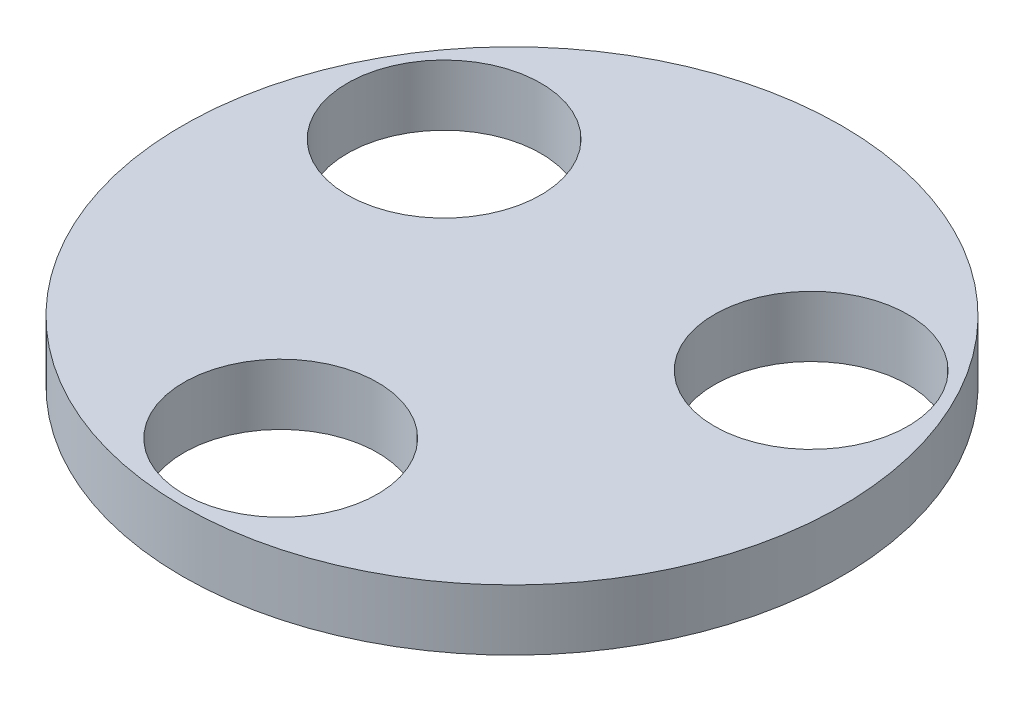
ISO-10303-21;
HEADER;
FILE_DESCRIPTION(('STEP AP214'),'2;1');
FILE_NAME('part.step','',(''),(''),'','','');
FILE_SCHEMA(('AUTOMOTIVE_DESIGN { 1 0 10303 214 1 1 1 1 }'));
ENDSEC;
DATA;
#1=APPLICATION_CONTEXT('core data for automotive mechanical design processes');
#2=APPLICATION_PROTOCOL_DEFINITION('international standard','automotive_design',2000,#1);
#3=PRODUCT_CONTEXT('',#1,'mechanical');
#4=PRODUCT('Part','Part','',(#3));
#5=PRODUCT_RELATED_PRODUCT_CATEGORY('part','',(#4));
#6=PRODUCT_DEFINITION_FORMATION('','',#4);
#7=PRODUCT_DEFINITION_CONTEXT('part definition',#1,'design');
#8=PRODUCT_DEFINITION('design','',#6,#7);
#9=PRODUCT_DEFINITION_SHAPE('','',#8);
#10=(LENGTH_UNIT() NAMED_UNIT(*) SI_UNIT(.MILLI.,.METRE.));
#11=(NAMED_UNIT(*) PLANE_ANGLE_UNIT() SI_UNIT($,.RADIAN.));
#12=(NAMED_UNIT(*) SI_UNIT($,.STERADIAN.) SOLID_ANGLE_UNIT());
#13=UNCERTAINTY_MEASURE_WITH_UNIT(LENGTH_MEASURE(1.E-05),#10,'distance_accuracy_value','');
#14=(GEOMETRIC_REPRESENTATION_CONTEXT(3) GLOBAL_UNCERTAINTY_ASSIGNED_CONTEXT((#13)) GLOBAL_UNIT_ASSIGNED_CONTEXT((#10,
#11,#12)) REPRESENTATION_CONTEXT('',''));
#15=CARTESIAN_POINT('',(0.,0.,0.));
#16=DIRECTION('',(0.,0.,1.));
#17=DIRECTION('',(1.,0.,0.));
#18=AXIS2_PLACEMENT_3D('',#15,#16,#17);
#19=CARTESIAN_POINT('',(0.,6.,0.));
#20=DIRECTION('',(0.,-1.,0.));
#21=DIRECTION('',(0.,0.,-1.));
#22=AXIS2_PLACEMENT_3D('',#19,#20,#21);
#23=CYLINDRICAL_SURFACE('',#22,32.5);
#24=CARTESIAN_POINT('',(0.,6.,0.));
#25=DIRECTION('',(0.,1.,0.));
#26=DIRECTION('',(0.,0.,1.));
#27=AXIS2_PLACEMENT_3D('',#24,#25,#26);
#28=CIRCLE('',#27,32.5);
#29=CARTESIAN_POINT('',(0.,6.,32.5));
#30=VERTEX_POINT('',#29);
#31=EDGE_CURVE('E10',#30,#30,#28,.T.);
#32=ORIENTED_EDGE('',*,*,#31,.F.);
#33=EDGE_LOOP('',(#32));
#34=FACE_BOUND('',#33,.T.);
#35=CARTESIAN_POINT('',(0.,0.,0.));
#36=DIRECTION('',(0.,1.,0.));
#37=DIRECTION('',(0.,0.,1.));
#38=AXIS2_PLACEMENT_3D('',#35,#36,#37);
#39=CIRCLE('',#38,32.5);
#40=CARTESIAN_POINT('',(0.,0.,32.5));
#41=VERTEX_POINT('',#40);
#42=EDGE_CURVE('E38',#41,#41,#39,.T.);
#43=ORIENTED_EDGE('',*,*,#42,.T.);
#44=EDGE_LOOP('',(#43));
#45=FACE_BOUND('',#44,.T.);
#46=ADVANCED_FACE('F31',(#34,#45),#23,.T.);
#47=CARTESIAN_POINT('',(0.,6.,0.));
#48=DIRECTION('',(0.,1.,0.));
#49=DIRECTION('',(0.,0.,1.));
#50=AXIS2_PLACEMENT_3D('',#47,#48,#49);
#51=PLANE('',#50);
#52=CARTESIAN_POINT('',(19.4033619757735,6.,-10.1007509145166));
#53=DIRECTION('',(0.,1.,0.));
#54=DIRECTION('',(0.,0.,1.));
#55=AXIS2_PLACEMENT_3D('',#52,#53,#54);
#56=CIRCLE('',#55,9.55);
#57=CARTESIAN_POINT('',(19.4033619757735,6.,-0.550750914516594));
#58=VERTEX_POINT('',#57);
#59=EDGE_CURVE('E98',#58,#58,#56,.T.);
#60=ORIENTED_EDGE('',*,*,#59,.F.);
#61=EDGE_LOOP('',(#60));
#62=FACE_BOUND('',#61,.T.);
#63=CARTESIAN_POINT('',(-0.954174098616478,6.,21.8541798471032));
#64=DIRECTION('',(0.,1.,0.));
#65=DIRECTION('',(0.,0.,1.));
#66=AXIS2_PLACEMENT_3D('',#63,#64,#65);
#67=CIRCLE('',#66,9.55);
#68=CARTESIAN_POINT('',(-0.954174098616478,6.,31.4041798471031));
#69=VERTEX_POINT('',#68);
#70=EDGE_CURVE('E96',#69,#69,#67,.T.);
#71=ORIENTED_EDGE('',*,*,#70,.F.);
#72=EDGE_LOOP('',(#71));
#73=FACE_BOUND('',#72,.T.);
#74=CARTESIAN_POINT('',(-18.449187877157,6.,-11.7534289325866));
#75=DIRECTION('',(0.,1.,0.));
#76=DIRECTION('',(0.,0.,1.));
#77=AXIS2_PLACEMENT_3D('',#74,#75,#76);
#78=CIRCLE('',#77,9.55);
#79=CARTESIAN_POINT('',(-18.449187877157,6.,-2.20342893258656));
#80=VERTEX_POINT('',#79);
#81=EDGE_CURVE('E45',#80,#80,#78,.T.);
#82=ORIENTED_EDGE('',*,*,#81,.F.);
#83=EDGE_LOOP('',(#82));
#84=FACE_BOUND('',#83,.T.);
#85=ORIENTED_EDGE('',*,*,#31,.T.);
#86=EDGE_LOOP('',(#85));
#87=FACE_BOUND('',#86,.T.);
#88=ADVANCED_FACE('F73',(#62,#73,#84,#87),#51,.T.);
#89=CARTESIAN_POINT('',(0.,0.,0.));
#90=DIRECTION('',(0.,1.,0.));
#91=DIRECTION('',(0.,0.,1.));
#92=AXIS2_PLACEMENT_3D('',#89,#90,#91);
#93=PLANE('',#92);
#94=CARTESIAN_POINT('',(19.4033619757735,0.,-10.1007509145166));
#95=DIRECTION('',(0.,1.,0.));
#96=DIRECTION('',(0.,0.,1.));
#97=AXIS2_PLACEMENT_3D('',#94,#95,#96);
#98=CIRCLE('',#97,9.55);
#99=CARTESIAN_POINT('',(19.4033619757735,0.,-0.550750914516594));
#100=VERTEX_POINT('',#99);
#101=EDGE_CURVE('E34',#100,#100,#98,.T.);
#102=ORIENTED_EDGE('',*,*,#101,.T.);
#103=EDGE_LOOP('',(#102));
#104=FACE_BOUND('',#103,.T.);
#105=CARTESIAN_POINT('',(-0.954174098616478,0.,21.8541798471032));
#106=DIRECTION('',(0.,1.,0.));
#107=DIRECTION('',(0.,0.,1.));
#108=AXIS2_PLACEMENT_3D('',#105,#106,#107);
#109=CIRCLE('',#108,9.55);
#110=CARTESIAN_POINT('',(-0.954174098616478,0.,31.4041798471031));
#111=VERTEX_POINT('',#110);
#112=EDGE_CURVE('E50',#111,#111,#109,.T.);
#113=ORIENTED_EDGE('',*,*,#112,.T.);
#114=EDGE_LOOP('',(#113));
#115=FACE_BOUND('',#114,.T.);
#116=CARTESIAN_POINT('',(-18.449187877157,0.,-11.7534289325866));
#117=DIRECTION('',(0.,1.,0.));
#118=DIRECTION('',(0.,0.,1.));
#119=AXIS2_PLACEMENT_3D('',#116,#117,#118);
#120=CIRCLE('',#119,9.55);
#121=CARTESIAN_POINT('',(-18.449187877157,0.,-2.20342893258656));
#122=VERTEX_POINT('',#121);
#123=EDGE_CURVE('E48',#122,#122,#120,.T.);
#124=ORIENTED_EDGE('',*,*,#123,.T.);
#125=EDGE_LOOP('',(#124));
#126=FACE_BOUND('',#125,.T.);
#127=ORIENTED_EDGE('',*,*,#42,.F.);
#128=EDGE_LOOP('',(#127));
#129=FACE_BOUND('',#128,.T.);
#130=ADVANCED_FACE('F57',(#104,#115,#126,#129),#93,.F.);
#131=CARTESIAN_POINT('',(-18.449187877157,-4.,-11.7534289325866));
#132=DIRECTION('',(0.,1.,0.));
#133=DIRECTION('',(0.,0.,1.));
#134=AXIS2_PLACEMENT_3D('',#131,#132,#133);
#135=CYLINDRICAL_SURFACE('',#134,9.55);
#136=ORIENTED_EDGE('',*,*,#81,.T.);
#137=EDGE_LOOP('',(#136));
#138=FACE_BOUND('',#137,.T.);
#139=ORIENTED_EDGE('',*,*,#123,.F.);
#140=EDGE_LOOP('',(#139));
#141=FACE_BOUND('',#140,.T.);
#142=ADVANCED_FACE('F67',(#138,#141),#135,.F.);
#143=CARTESIAN_POINT('',(-0.954174098616478,-4.,21.8541798471032));
#144=DIRECTION('',(0.,1.,0.));
#145=DIRECTION('',(0.,0.,1.));
#146=AXIS2_PLACEMENT_3D('',#143,#144,#145);
#147=CYLINDRICAL_SURFACE('',#146,9.55);
#148=ORIENTED_EDGE('',*,*,#70,.T.);
#149=EDGE_LOOP('',(#148));
#150=FACE_BOUND('',#149,.T.);
#151=ORIENTED_EDGE('',*,*,#112,.F.);
#152=EDGE_LOOP('',(#151));
#153=FACE_BOUND('',#152,.T.);
#154=ADVANCED_FACE('F61',(#150,#153),#147,.F.);
#155=CARTESIAN_POINT('',(19.4033619757735,-4.,-10.1007509145166));
#156=DIRECTION('',(0.,1.,0.));
#157=DIRECTION('',(0.,0.,1.));
#158=AXIS2_PLACEMENT_3D('',#155,#156,#157);
#159=CYLINDRICAL_SURFACE('',#158,9.55);
#160=ORIENTED_EDGE('',*,*,#59,.T.);
#161=EDGE_LOOP('',(#160));
#162=FACE_BOUND('',#161,.T.);
#163=ORIENTED_EDGE('',*,*,#101,.F.);
#164=EDGE_LOOP('',(#163));
#165=FACE_BOUND('',#164,.T.);
#166=ADVANCED_FACE('F59',(#162,#165),#159,.F.);
#167=CLOSED_SHELL('',(#46,#88,#130,#142,#154,#166));
#168=MANIFOLD_SOLID_BREP('B2',#167);
#169=ADVANCED_BREP_SHAPE_REPRESENTATION('',(#18,#168),#14);
#170=SHAPE_DEFINITION_REPRESENTATION(#9,#169);
ENDSEC;
END-ISO-10303-21;
